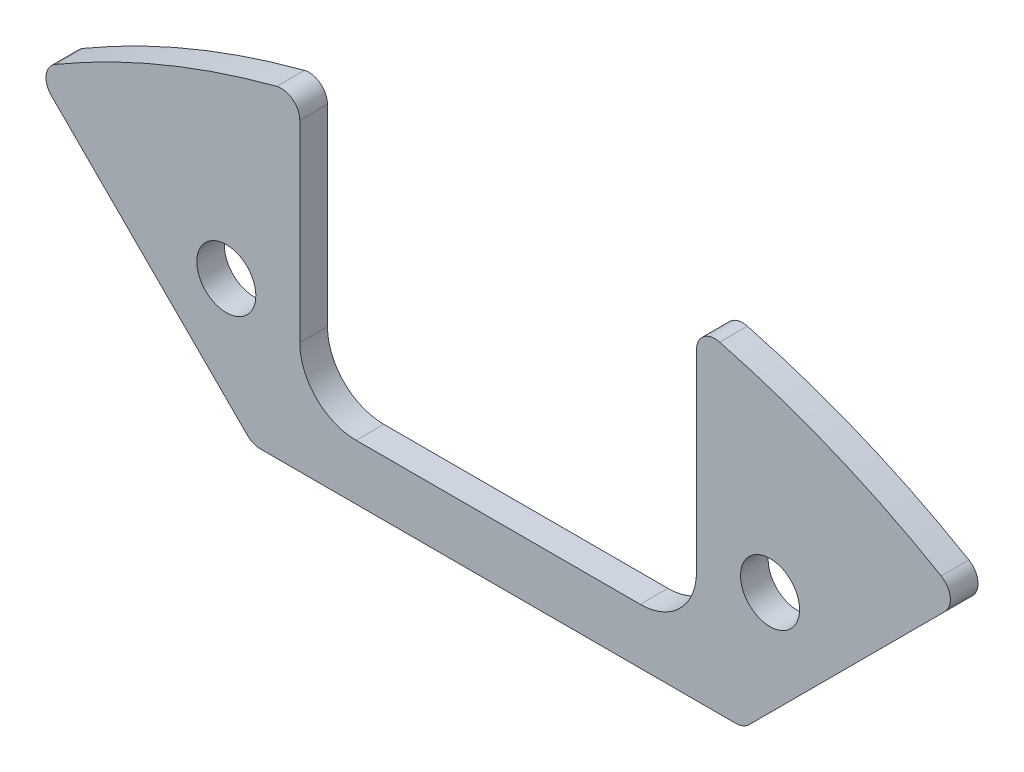
ISO-10303-21;
HEADER;
FILE_DESCRIPTION(('STEP AP214'),'2;1');
FILE_NAME('part.step','',(''),(''),'','','');
FILE_SCHEMA(('AUTOMOTIVE_DESIGN { 1 0 10303 214 1 1 1 1 }'));
ENDSEC;
DATA;
#1=APPLICATION_CONTEXT('core data for automotive mechanical design processes');
#2=APPLICATION_PROTOCOL_DEFINITION('international standard','automotive_design',2000,#1);
#3=PRODUCT_CONTEXT('',#1,'mechanical');
#4=PRODUCT('Part','Part','',(#3));
#5=PRODUCT_RELATED_PRODUCT_CATEGORY('part','',(#4));
#6=PRODUCT_DEFINITION_FORMATION('','',#4);
#7=PRODUCT_DEFINITION_CONTEXT('part definition',#1,'design');
#8=PRODUCT_DEFINITION('design','',#6,#7);
#9=PRODUCT_DEFINITION_SHAPE('','',#8);
#10=(LENGTH_UNIT() NAMED_UNIT(*) SI_UNIT(.MILLI.,.METRE.));
#11=(NAMED_UNIT(*) PLANE_ANGLE_UNIT() SI_UNIT($,.RADIAN.));
#12=(NAMED_UNIT(*) SI_UNIT($,.STERADIAN.) SOLID_ANGLE_UNIT());
#13=UNCERTAINTY_MEASURE_WITH_UNIT(LENGTH_MEASURE(1.E-05),#10,'distance_accuracy_value','');
#14=(GEOMETRIC_REPRESENTATION_CONTEXT(3) GLOBAL_UNCERTAINTY_ASSIGNED_CONTEXT((#13)) GLOBAL_UNIT_ASSIGNED_CONTEXT((#10,
#11,#12)) REPRESENTATION_CONTEXT('',''));
#15=CARTESIAN_POINT('',(0.,0.,0.));
#16=DIRECTION('',(0.,0.,1.));
#17=DIRECTION('',(1.,0.,0.));
#18=AXIS2_PLACEMENT_3D('',#15,#16,#17);
#19=CARTESIAN_POINT('',(0.,0.,1.5));
#20=DIRECTION('',(0.,0.,-1.));
#21=DIRECTION('',(-1.,0.,0.));
#22=AXIS2_PLACEMENT_3D('',#19,#20,#21);
#23=CYLINDRICAL_SURFACE('',#22,47.5);
#24=CARTESIAN_POINT('',(0.,0.,0.));
#25=DIRECTION('',(0.,0.,1.));
#26=DIRECTION('',(1.,0.,0.));
#27=AXIS2_PLACEMENT_3D('',#24,#25,#26);
#28=CIRCLE('',#27,47.5);
#29=CARTESIAN_POINT('',(-12.002688172043,45.9585190867232,0.));
#30=VERTEX_POINT('',#29);
#31=CARTESIAN_POINT('',(-24.0103983005942,40.9847626984325,0.));
#32=VERTEX_POINT('',#31);
#33=EDGE_CURVE('E171',#30,#32,#28,.T.);
#34=ORIENTED_EDGE('',*,*,#33,.T.);
#35=DIRECTION('',(0.,0.,-1.));
#36=VECTOR('',#35,1.);
#37=CARTESIAN_POINT('',(-24.0103983005942,40.9847626984325,1.5));
#38=LINE('',#37,#36);
#39=CARTESIAN_POINT('',(-24.0103983005942,40.9847626984325,1.5));
#40=VERTEX_POINT('',#39);
#41=EDGE_CURVE('E213',#32,#40,#38,.F.);
#42=ORIENTED_EDGE('',*,*,#41,.T.);
#43=CARTESIAN_POINT('',(0.,0.,1.5));
#44=DIRECTION('',(0.,0.,1.));
#45=DIRECTION('',(1.,0.,0.));
#46=AXIS2_PLACEMENT_3D('',#43,#44,#45);
#47=CIRCLE('',#46,47.5);
#48=CARTESIAN_POINT('',(-12.002688172043,45.9585190867232,1.5));
#49=VERTEX_POINT('',#48);
#50=EDGE_CURVE('E174',#49,#40,#47,.T.);
#51=ORIENTED_EDGE('',*,*,#50,.F.);
#52=DIRECTION('',(0.,0.,-1.));
#53=VECTOR('',#52,1.);
#54=CARTESIAN_POINT('',(-12.002688172043,45.9585190867232,1.5));
#55=LINE('',#54,#53);
#56=EDGE_CURVE('E159',#49,#30,#55,.T.);
#57=ORIENTED_EDGE('',*,*,#56,.T.);
#58=EDGE_LOOP('',(#34,#42,#51,#57));
#59=FACE_BOUND('',#58,.T.);
#60=ADVANCED_FACE('F39',(#59),#23,.T.);
#61=CARTESIAN_POINT('',(24.0103983005937,40.9847626984328,1.5));
#62=VERTEX_POINT('',#61);
#63=CARTESIAN_POINT('',(12.002688172043,45.9585190867232,1.5));
#64=VERTEX_POINT('',#63);
#65=EDGE_CURVE('E181',#62,#64,#47,.T.);
#66=ORIENTED_EDGE('',*,*,#65,.F.);
#67=DIRECTION('',(0.,0.,-1.));
#68=VECTOR('',#67,1.);
#69=CARTESIAN_POINT('',(24.0103983005937,40.9847626984328,1.5));
#70=LINE('',#69,#68);
#71=CARTESIAN_POINT('',(24.0103983005937,40.9847626984328,0.));
#72=VERTEX_POINT('',#71);
#73=EDGE_CURVE('E304',#62,#72,#70,.T.);
#74=ORIENTED_EDGE('',*,*,#73,.T.);
#75=CARTESIAN_POINT('',(12.002688172043,45.9585190867232,0.));
#76=VERTEX_POINT('',#75);
#77=EDGE_CURVE('E182',#72,#76,#28,.T.);
#78=ORIENTED_EDGE('',*,*,#77,.T.);
#79=DIRECTION('',(0.,0.,-1.));
#80=VECTOR('',#79,1.);
#81=CARTESIAN_POINT('',(12.002688172043,45.9585190867232,1.5));
#82=LINE('',#81,#80);
#83=EDGE_CURVE('E175',#76,#64,#82,.F.);
#84=ORIENTED_EDGE('',*,*,#83,.T.);
#85=EDGE_LOOP('',(#66,#74,#78,#84));
#86=FACE_BOUND('',#85,.T.);
#87=ADVANCED_FACE('F358',(#86),#23,.T.);
#88=CARTESIAN_POINT('',(0.,0.,1.5));
#89=DIRECTION('',(0.,0.,1.));
#90=DIRECTION('',(1.,0.,0.));
#91=AXIS2_PLACEMENT_3D('',#88,#89,#90);
#92=PLANE('',#91);
#93=DIRECTION('',(1.,0.,0.));
#94=VECTOR('',#93,1.);
#95=CARTESIAN_POINT('',(0.,28.5,1.5));
#96=LINE('',#95,#94);
#97=CARTESIAN_POINT('',(-12.8829906421162,28.5,1.5));
#98=VERTEX_POINT('',#97);
#99=CARTESIAN_POINT('',(12.8829906421156,28.5,1.5));
#100=VERTEX_POINT('',#99);
#101=EDGE_CURVE('E287',#98,#100,#96,.T.);
#102=ORIENTED_EDGE('',*,*,#101,.T.);
#103=CARTESIAN_POINT('',(12.8829906421156,29.5,1.5));
#104=DIRECTION('',(0.,0.,1.));
#105=DIRECTION('',(1.,0.,0.));
#106=AXIS2_PLACEMENT_3D('',#103,#104,#105);
#107=CIRCLE('',#106,1.);
#108=CARTESIAN_POINT('',(13.5900974233022,28.7928932188135,1.5));
#109=VERTEX_POINT('',#108);
#110=EDGE_CURVE('E280',#100,#109,#107,.T.);
#111=ORIENTED_EDGE('',*,*,#110,.T.);
#112=DIRECTION('',(-0.707106781186539,-0.707106781186556,0.));
#113=VECTOR('',#112,1.);
#114=CARTESIAN_POINT('',(14.6724657096205,29.8752615051318,1.5));
#115=LINE('',#114,#113);
#116=CARTESIAN_POINT('',(24.212023012294,39.4148188078056,1.5));
#117=VERTEX_POINT('',#116);
#118=EDGE_CURVE('E264',#117,#109,#115,.T.);
#119=ORIENTED_EDGE('',*,*,#118,.F.);
#120=CARTESIAN_POINT('',(23.5049162311075,40.1219255889921,1.5));
#121=DIRECTION('',(0.,0.,1.));
#122=DIRECTION('',(1.,0.,0.));
#123=AXIS2_PLACEMENT_3D('',#120,#121,#122);
#124=CIRCLE('',#123,1.);
#125=EDGE_CURVE('E218',#117,#62,#124,.T.);
#126=ORIENTED_EDGE('',*,*,#125,.T.);
#127=ORIENTED_EDGE('',*,*,#65,.T.);
#128=CARTESIAN_POINT('',(11.75,44.9909713164764,1.5));
#129=DIRECTION('',(0.,0.,1.));
#130=DIRECTION('',(1.,0.,0.));
#131=AXIS2_PLACEMENT_3D('',#128,#129,#130);
#132=CIRCLE('',#131,1.);
#133=CARTESIAN_POINT('',(10.75,44.9909713164764,1.5));
#134=VERTEX_POINT('',#133);
#135=EDGE_CURVE('E194',#64,#134,#132,.T.);
#136=ORIENTED_EDGE('',*,*,#135,.T.);
#137=DIRECTION('',(0.,1.,0.));
#138=VECTOR('',#137,1.);
#139=CARTESIAN_POINT('',(10.75,43.525,1.5));
#140=LINE('',#139,#138);
#141=CARTESIAN_POINT('',(10.75,34.55,1.5));
#142=VERTEX_POINT('',#141);
#143=EDGE_CURVE('E231',#142,#134,#140,.T.);
#144=ORIENTED_EDGE('',*,*,#143,.F.);
#145=CARTESIAN_POINT('',(7.70000000000001,34.55,1.5));
#146=DIRECTION('',(0.,0.,1.));
#147=DIRECTION('',(1.,0.,0.));
#148=AXIS2_PLACEMENT_3D('',#145,#146,#147);
#149=CIRCLE('',#148,3.05);
#150=CARTESIAN_POINT('',(7.70000000000001,31.5,1.5));
#151=VERTEX_POINT('',#150);
#152=EDGE_CURVE('E337',#142,#151,#149,.F.);
#153=ORIENTED_EDGE('',*,*,#152,.T.);
#154=DIRECTION('',(1.,0.,0.));
#155=VECTOR('',#154,1.);
#156=CARTESIAN_POINT('',(-10.75,31.5,1.5));
#157=LINE('',#156,#155);
#158=CARTESIAN_POINT('',(-7.69999999999999,31.5,1.5));
#159=VERTEX_POINT('',#158);
#160=EDGE_CURVE('E240',#159,#151,#157,.T.);
#161=ORIENTED_EDGE('',*,*,#160,.F.);
#162=CARTESIAN_POINT('',(-7.69999999999999,34.55,1.5));
#163=DIRECTION('',(0.,0.,1.));
#164=DIRECTION('',(1.,0.,0.));
#165=AXIS2_PLACEMENT_3D('',#162,#163,#164);
#166=CIRCLE('',#165,3.05);
#167=CARTESIAN_POINT('',(-10.75,34.55,1.5));
#168=VERTEX_POINT('',#167);
#169=EDGE_CURVE('E329',#159,#168,#166,.F.);
#170=ORIENTED_EDGE('',*,*,#169,.T.);
#171=DIRECTION('',(0.,-1.,0.));
#172=VECTOR('',#171,1.);
#173=CARTESIAN_POINT('',(-10.75,31.5,1.5));
#174=LINE('',#173,#172);
#175=CARTESIAN_POINT('',(-10.75,44.9909713164764,1.5));
#176=VERTEX_POINT('',#175);
#177=EDGE_CURVE('E235',#176,#168,#174,.T.);
#178=ORIENTED_EDGE('',*,*,#177,.F.);
#179=CARTESIAN_POINT('',(-11.75,44.9909713164764,1.5));
#180=DIRECTION('',(0.,0.,1.));
#181=DIRECTION('',(1.,0.,0.));
#182=AXIS2_PLACEMENT_3D('',#179,#180,#181);
#183=CIRCLE('',#182,1.);
#184=EDGE_CURVE('E191',#176,#49,#183,.T.);
#185=ORIENTED_EDGE('',*,*,#184,.T.);
#186=ORIENTED_EDGE('',*,*,#50,.T.);
#187=CARTESIAN_POINT('',(-23.504916231108,40.1219255889918,1.5));
#188=DIRECTION('',(0.,0.,1.));
#189=DIRECTION('',(1.,0.,0.));
#190=AXIS2_PLACEMENT_3D('',#187,#188,#189);
#191=CIRCLE('',#190,1.);
#192=CARTESIAN_POINT('',(-24.2120230122946,39.4148188078052,1.5));
#193=VERTEX_POINT('',#192);
#194=EDGE_CURVE('E207',#40,#193,#191,.T.);
#195=ORIENTED_EDGE('',*,*,#194,.T.);
#196=DIRECTION('',(-0.707106781186549,0.707106781186546,0.));
#197=VECTOR('',#196,1.);
#198=CARTESIAN_POINT('',(-23.1754247533892,38.3782205488998,1.5));
#199=LINE('',#198,#197);
#200=CARTESIAN_POINT('',(-13.5900974233028,28.7928932188135,1.5));
#201=VERTEX_POINT('',#200);
#202=EDGE_CURVE('E260',#201,#193,#199,.T.);
#203=ORIENTED_EDGE('',*,*,#202,.F.);
#204=CARTESIAN_POINT('',(-12.8829906421162,29.5,1.5));
#205=DIRECTION('',(0.,0.,1.));
#206=DIRECTION('',(1.,0.,0.));
#207=AXIS2_PLACEMENT_3D('',#204,#205,#206);
#208=CIRCLE('',#207,1.);
#209=EDGE_CURVE('E276',#201,#98,#208,.T.);
#210=ORIENTED_EDGE('',*,*,#209,.T.);
#211=EDGE_LOOP('',(#102,#111,#119,#126,#127,#136,#144,#153,#161,#170,#178,#185,#186,#195,#203,#210));
#212=FACE_BOUND('',#211,.T.);
#213=CARTESIAN_POINT('',(-14.7333121460563,35.5693620016844,1.5));
#214=DIRECTION('',(0.,0.,1.));
#215=DIRECTION('',(0.707106781186546,0.707106781186549,0.));
#216=AXIS2_PLACEMENT_3D('',#213,#214,#215);
#217=CIRCLE('',#216,1.6);
#218=CARTESIAN_POINT('',(-13.6019412961578,36.7007328515829,1.5));
#219=VERTEX_POINT('',#218);
#220=EDGE_CURVE('E269',#219,#219,#217,.T.);
#221=ORIENTED_EDGE('',*,*,#220,.F.);
#222=EDGE_LOOP('',(#221));
#223=FACE_BOUND('',#222,.T.);
#224=CARTESIAN_POINT('',(14.7333121460557,35.5693620016846,1.5));
#225=DIRECTION('',(0.,0.,1.));
#226=DIRECTION('',(1.,0.,0.));
#227=AXIS2_PLACEMENT_3D('',#224,#225,#226);
#228=CIRCLE('',#227,1.6);
#229=CARTESIAN_POINT('',(16.3333121460557,35.5693620016846,1.5));
#230=VERTEX_POINT('',#229);
#231=EDGE_CURVE('E254',#230,#230,#228,.T.);
#232=ORIENTED_EDGE('',*,*,#231,.F.);
#233=EDGE_LOOP('',(#232));
#234=FACE_BOUND('',#233,.T.);
#235=ADVANCED_FACE('F318',(#212,#223,#234),#92,.T.);
#236=CARTESIAN_POINT('',(0.,0.,0.));
#237=DIRECTION('',(0.,0.,1.));
#238=DIRECTION('',(1.,0.,0.));
#239=AXIS2_PLACEMENT_3D('',#236,#237,#238);
#240=PLANE('',#239);
#241=DIRECTION('',(-0.707106781186539,-0.707106781186556,0.));
#242=VECTOR('',#241,1.);
#243=CARTESIAN_POINT('',(14.6724657096205,29.8752615051318,0.));
#244=LINE('',#243,#242);
#245=CARTESIAN_POINT('',(24.212023012294,39.4148188078056,0.));
#246=VERTEX_POINT('',#245);
#247=CARTESIAN_POINT('',(13.5900974233022,28.7928932188135,0.));
#248=VERTEX_POINT('',#247);
#249=EDGE_CURVE('E263',#246,#248,#244,.T.);
#250=ORIENTED_EDGE('',*,*,#249,.T.);
#251=CARTESIAN_POINT('',(12.8829906421156,29.5,0.));
#252=DIRECTION('',(0.,0.,1.));
#253=DIRECTION('',(1.,0.,0.));
#254=AXIS2_PLACEMENT_3D('',#251,#252,#253);
#255=CIRCLE('',#254,1.);
#256=CARTESIAN_POINT('',(12.8829906421156,28.5,0.));
#257=VERTEX_POINT('',#256);
#258=EDGE_CURVE('E47',#248,#257,#255,.F.);
#259=ORIENTED_EDGE('',*,*,#258,.T.);
#260=DIRECTION('',(1.,0.,0.));
#261=VECTOR('',#260,1.);
#262=CARTESIAN_POINT('',(0.,28.5,0.));
#263=LINE('',#262,#261);
#264=CARTESIAN_POINT('',(-12.8829906421162,28.5,0.));
#265=VERTEX_POINT('',#264);
#266=EDGE_CURVE('E273',#265,#257,#263,.T.);
#267=ORIENTED_EDGE('',*,*,#266,.F.);
#268=CARTESIAN_POINT('',(-12.8829906421162,29.5,0.));
#269=DIRECTION('',(0.,0.,1.));
#270=DIRECTION('',(1.,0.,0.));
#271=AXIS2_PLACEMENT_3D('',#268,#269,#270);
#272=CIRCLE('',#271,1.);
#273=CARTESIAN_POINT('',(-13.5900974233028,28.7928932188135,0.));
#274=VERTEX_POINT('',#273);
#275=EDGE_CURVE('E54',#265,#274,#272,.F.);
#276=ORIENTED_EDGE('',*,*,#275,.T.);
#277=DIRECTION('',(-0.707106781186549,0.707106781186546,0.));
#278=VECTOR('',#277,1.);
#279=CARTESIAN_POINT('',(-23.1754247533892,38.3782205488998,0.));
#280=LINE('',#279,#278);
#281=CARTESIAN_POINT('',(-24.2120230122946,39.4148188078052,0.));
#282=VERTEX_POINT('',#281);
#283=EDGE_CURVE('E258',#274,#282,#280,.T.);
#284=ORIENTED_EDGE('',*,*,#283,.T.);
#285=CARTESIAN_POINT('',(-23.504916231108,40.1219255889918,0.));
#286=DIRECTION('',(0.,0.,1.));
#287=DIRECTION('',(1.,0.,0.));
#288=AXIS2_PLACEMENT_3D('',#285,#286,#287);
#289=CIRCLE('',#288,1.);
#290=EDGE_CURVE('E180',#282,#32,#289,.F.);
#291=ORIENTED_EDGE('',*,*,#290,.T.);
#292=ORIENTED_EDGE('',*,*,#33,.F.);
#293=CARTESIAN_POINT('',(-11.75,44.9909713164764,0.));
#294=DIRECTION('',(0.,0.,1.));
#295=DIRECTION('',(1.,0.,0.));
#296=AXIS2_PLACEMENT_3D('',#293,#294,#295);
#297=CIRCLE('',#296,1.);
#298=CARTESIAN_POINT('',(-10.75,44.9909713164764,0.));
#299=VERTEX_POINT('',#298);
#300=EDGE_CURVE('E155',#30,#299,#297,.F.);
#301=ORIENTED_EDGE('',*,*,#300,.T.);
#302=DIRECTION('',(0.,-1.,0.));
#303=VECTOR('',#302,1.);
#304=CARTESIAN_POINT('',(-10.75,31.5,0.));
#305=LINE('',#304,#303);
#306=CARTESIAN_POINT('',(-10.75,34.55,0.));
#307=VERTEX_POINT('',#306);
#308=EDGE_CURVE('E249',#299,#307,#305,.T.);
#309=ORIENTED_EDGE('',*,*,#308,.T.);
#310=CARTESIAN_POINT('',(-7.69999999999999,34.55,0.));
#311=DIRECTION('',(0.,0.,1.));
#312=DIRECTION('',(1.,0.,0.));
#313=AXIS2_PLACEMENT_3D('',#310,#311,#312);
#314=CIRCLE('',#313,3.05);
#315=CARTESIAN_POINT('',(-7.69999999999999,31.5,0.));
#316=VERTEX_POINT('',#315);
#317=EDGE_CURVE('E328',#307,#316,#314,.T.);
#318=ORIENTED_EDGE('',*,*,#317,.T.);
#319=DIRECTION('',(1.,0.,0.));
#320=VECTOR('',#319,1.);
#321=CARTESIAN_POINT('',(-10.75,31.5,0.));
#322=LINE('',#321,#320);
#323=CARTESIAN_POINT('',(7.70000000000001,31.5,0.));
#324=VERTEX_POINT('',#323);
#325=EDGE_CURVE('E185',#316,#324,#322,.T.);
#326=ORIENTED_EDGE('',*,*,#325,.T.);
#327=CARTESIAN_POINT('',(7.70000000000001,34.55,0.));
#328=DIRECTION('',(0.,0.,1.));
#329=DIRECTION('',(1.,0.,0.));
#330=AXIS2_PLACEMENT_3D('',#327,#328,#329);
#331=CIRCLE('',#330,3.05);
#332=CARTESIAN_POINT('',(10.75,34.55,0.));
#333=VERTEX_POINT('',#332);
#334=EDGE_CURVE('E333',#324,#333,#331,.T.);
#335=ORIENTED_EDGE('',*,*,#334,.T.);
#336=DIRECTION('',(0.,1.,0.));
#337=VECTOR('',#336,1.);
#338=CARTESIAN_POINT('',(10.75,43.525,0.));
#339=LINE('',#338,#337);
#340=CARTESIAN_POINT('',(10.75,44.9909713164764,0.));
#341=VERTEX_POINT('',#340);
#342=EDGE_CURVE('E243',#333,#341,#339,.T.);
#343=ORIENTED_EDGE('',*,*,#342,.T.);
#344=CARTESIAN_POINT('',(11.75,44.9909713164764,0.));
#345=DIRECTION('',(0.,0.,1.));
#346=DIRECTION('',(1.,0.,0.));
#347=AXIS2_PLACEMENT_3D('',#344,#345,#346);
#348=CIRCLE('',#347,1.);
#349=EDGE_CURVE('E164',#341,#76,#348,.F.);
#350=ORIENTED_EDGE('',*,*,#349,.T.);
#351=ORIENTED_EDGE('',*,*,#77,.F.);
#352=CARTESIAN_POINT('',(23.5049162311075,40.1219255889921,0.));
#353=DIRECTION('',(0.,0.,1.));
#354=DIRECTION('',(1.,0.,0.));
#355=AXIS2_PLACEMENT_3D('',#352,#353,#354);
#356=CIRCLE('',#355,1.);
#357=EDGE_CURVE('E221',#72,#246,#356,.F.);
#358=ORIENTED_EDGE('',*,*,#357,.T.);
#359=EDGE_LOOP('',(#250,#259,#267,#276,#284,#291,#292,#301,#309,#318,#326,#335,#343,#350,#351,#358));
#360=FACE_BOUND('',#359,.T.);
#361=CARTESIAN_POINT('',(-14.7333121460563,35.5693620016844,0.));
#362=DIRECTION('',(0.,0.,1.));
#363=DIRECTION('',(0.707106781186546,0.707106781186549,0.));
#364=AXIS2_PLACEMENT_3D('',#361,#362,#363);
#365=CIRCLE('',#364,1.6);
#366=CARTESIAN_POINT('',(-13.6019412961578,36.7007328515829,0.));
#367=VERTEX_POINT('',#366);
#368=EDGE_CURVE('E267',#367,#367,#365,.T.);
#369=ORIENTED_EDGE('',*,*,#368,.T.);
#370=EDGE_LOOP('',(#369));
#371=FACE_BOUND('',#370,.T.);
#372=CARTESIAN_POINT('',(14.7333121460557,35.5693620016846,0.));
#373=DIRECTION('',(0.,0.,1.));
#374=DIRECTION('',(1.,0.,0.));
#375=AXIS2_PLACEMENT_3D('',#372,#373,#374);
#376=CIRCLE('',#375,1.6);
#377=CARTESIAN_POINT('',(16.3333121460557,35.5693620016846,0.));
#378=VERTEX_POINT('',#377);
#379=EDGE_CURVE('E236',#378,#378,#376,.T.);
#380=ORIENTED_EDGE('',*,*,#379,.T.);
#381=EDGE_LOOP('',(#380));
#382=FACE_BOUND('',#381,.T.);
#383=ADVANCED_FACE('F177',(#360,#371,#382),#240,.F.);
#384=CARTESIAN_POINT('',(10.75,43.525,0.));
#385=DIRECTION('',(1.,0.,0.));
#386=DIRECTION('',(0.,1.,0.));
#387=AXIS2_PLACEMENT_3D('',#384,#385,#386);
#388=PLANE('',#387);
#389=ORIENTED_EDGE('',*,*,#143,.T.);
#390=DIRECTION('',(0.,0.,-1.));
#391=VECTOR('',#390,1.);
#392=CARTESIAN_POINT('',(10.75,44.9909713164764,0.));
#393=LINE('',#392,#391);
#394=EDGE_CURVE('E165',#134,#341,#393,.T.);
#395=ORIENTED_EDGE('',*,*,#394,.T.);
#396=ORIENTED_EDGE('',*,*,#342,.F.);
#397=DIRECTION('',(0.,0.,1.));
#398=VECTOR('',#397,1.);
#399=CARTESIAN_POINT('',(10.75,34.55,1.5));
#400=LINE('',#399,#398);
#401=EDGE_CURVE('E345',#333,#142,#400,.T.);
#402=ORIENTED_EDGE('',*,*,#401,.T.);
#403=EDGE_LOOP('',(#389,#395,#396,#402));
#404=FACE_BOUND('',#403,.T.);
#405=ADVANCED_FACE('F355',(#404),#388,.F.);
#406=CARTESIAN_POINT('',(-10.75,43.525,0.));
#407=DIRECTION('',(-1.,0.,0.));
#408=DIRECTION('',(0.,-1.,0.));
#409=AXIS2_PLACEMENT_3D('',#406,#407,#408);
#410=PLANE('',#409);
#411=ORIENTED_EDGE('',*,*,#308,.F.);
#412=DIRECTION('',(0.,0.,-1.));
#413=VECTOR('',#412,1.);
#414=CARTESIAN_POINT('',(-10.75,44.9909713164764,0.));
#415=LINE('',#414,#413);
#416=EDGE_CURVE('E161',#299,#176,#415,.F.);
#417=ORIENTED_EDGE('',*,*,#416,.T.);
#418=ORIENTED_EDGE('',*,*,#177,.T.);
#419=DIRECTION('',(0.,0.,1.));
#420=VECTOR('',#419,1.);
#421=CARTESIAN_POINT('',(-10.75,34.55,0.));
#422=LINE('',#421,#420);
#423=EDGE_CURVE('E339',#168,#307,#422,.F.);
#424=ORIENTED_EDGE('',*,*,#423,.T.);
#425=EDGE_LOOP('',(#411,#417,#418,#424));
#426=FACE_BOUND('',#425,.T.);
#427=ADVANCED_FACE('F407',(#426),#410,.F.);
#428=CARTESIAN_POINT('',(-10.75,31.5,0.));
#429=DIRECTION('',(0.,-1.,0.));
#430=DIRECTION('',(0.,0.,-1.));
#431=AXIS2_PLACEMENT_3D('',#428,#429,#430);
#432=PLANE('',#431);
#433=ORIENTED_EDGE('',*,*,#160,.T.);
#434=DIRECTION('',(0.,0.,1.));
#435=VECTOR('',#434,1.);
#436=CARTESIAN_POINT('',(7.70000000000001,31.5,0.));
#437=LINE('',#436,#435);
#438=EDGE_CURVE('E341',#151,#324,#437,.F.);
#439=ORIENTED_EDGE('',*,*,#438,.T.);
#440=ORIENTED_EDGE('',*,*,#325,.F.);
#441=DIRECTION('',(0.,0.,1.));
#442=VECTOR('',#441,1.);
#443=CARTESIAN_POINT('',(-7.69999999999999,31.5,1.5));
#444=LINE('',#443,#442);
#445=EDGE_CURVE('E343',#316,#159,#444,.T.);
#446=ORIENTED_EDGE('',*,*,#445,.T.);
#447=EDGE_LOOP('',(#433,#439,#440,#446));
#448=FACE_BOUND('',#447,.T.);
#449=ADVANCED_FACE('F403',(#448),#432,.F.);
#450=CARTESIAN_POINT('',(14.7333121460557,35.5693620016846,0.));
#451=DIRECTION('',(0.,0.,1.));
#452=DIRECTION('',(1.,0.,0.));
#453=AXIS2_PLACEMENT_3D('',#450,#451,#452);
#454=CYLINDRICAL_SURFACE('',#453,1.6);
#455=ORIENTED_EDGE('',*,*,#379,.F.);
#456=EDGE_LOOP('',(#455));
#457=FACE_BOUND('',#456,.T.);
#458=ORIENTED_EDGE('',*,*,#231,.T.);
#459=EDGE_LOOP('',(#458));
#460=FACE_BOUND('',#459,.T.);
#461=ADVANCED_FACE('F370',(#457,#460),#454,.F.);
#462=CARTESIAN_POINT('',(11.75,44.9909713164764,1.5));
#463=DIRECTION('',(0.,0.,-1.));
#464=DIRECTION('',(-1.,0.,0.));
#465=AXIS2_PLACEMENT_3D('',#462,#463,#464);
#466=CYLINDRICAL_SURFACE('',#465,1.);
#467=ORIENTED_EDGE('',*,*,#349,.F.);
#468=ORIENTED_EDGE('',*,*,#394,.F.);
#469=ORIENTED_EDGE('',*,*,#135,.F.);
#470=ORIENTED_EDGE('',*,*,#83,.F.);
#471=EDGE_LOOP('',(#467,#468,#469,#470));
#472=FACE_BOUND('',#471,.T.);
#473=ADVANCED_FACE('F357',(#472),#466,.T.);
#474=CARTESIAN_POINT('',(-11.75,44.9909713164764,1.5));
#475=DIRECTION('',(0.,0.,-1.));
#476=DIRECTION('',(-1.,0.,0.));
#477=AXIS2_PLACEMENT_3D('',#474,#475,#476);
#478=CYLINDRICAL_SURFACE('',#477,1.);
#479=ORIENTED_EDGE('',*,*,#184,.F.);
#480=ORIENTED_EDGE('',*,*,#416,.F.);
#481=ORIENTED_EDGE('',*,*,#300,.F.);
#482=ORIENTED_EDGE('',*,*,#56,.F.);
#483=EDGE_LOOP('',(#479,#480,#481,#482));
#484=FACE_BOUND('',#483,.T.);
#485=ADVANCED_FACE('F158',(#484),#478,.T.);
#486=CARTESIAN_POINT('',(7.70000000000001,34.55,0.));
#487=DIRECTION('',(0.,0.,-1.));
#488=DIRECTION('',(-1.,0.,0.));
#489=AXIS2_PLACEMENT_3D('',#486,#487,#488);
#490=CYLINDRICAL_SURFACE('',#489,3.05);
#491=ORIENTED_EDGE('',*,*,#334,.F.);
#492=ORIENTED_EDGE('',*,*,#438,.F.);
#493=ORIENTED_EDGE('',*,*,#152,.F.);
#494=ORIENTED_EDGE('',*,*,#401,.F.);
#495=EDGE_LOOP('',(#491,#492,#493,#494));
#496=FACE_BOUND('',#495,.T.);
#497=ADVANCED_FACE('F373',(#496),#490,.F.);
#498=CARTESIAN_POINT('',(-7.69999999999999,34.55,0.));
#499=DIRECTION('',(0.,0.,-1.));
#500=DIRECTION('',(-1.,0.,0.));
#501=AXIS2_PLACEMENT_3D('',#498,#499,#500);
#502=CYLINDRICAL_SURFACE('',#501,3.05);
#503=ORIENTED_EDGE('',*,*,#317,.F.);
#504=ORIENTED_EDGE('',*,*,#423,.F.);
#505=ORIENTED_EDGE('',*,*,#169,.F.);
#506=ORIENTED_EDGE('',*,*,#445,.F.);
#507=EDGE_LOOP('',(#503,#504,#505,#506));
#508=FACE_BOUND('',#507,.T.);
#509=ADVANCED_FACE('F376',(#508),#502,.F.);
#510=CARTESIAN_POINT('',(-23.1754247533892,38.3782205488998,0.));
#511=DIRECTION('',(0.707106781186546,0.707106781186548,0.));
#512=DIRECTION('',(-0.707106781186549,0.707106781186546,0.));
#513=AXIS2_PLACEMENT_3D('',#510,#511,#512);
#514=PLANE('',#513);
#515=ORIENTED_EDGE('',*,*,#283,.F.);
#516=DIRECTION('',(0.,0.,1.));
#517=VECTOR('',#516,1.);
#518=CARTESIAN_POINT('',(-13.5900974233028,28.7928932188135,1.5));
#519=LINE('',#518,#517);
#520=EDGE_CURVE('E12',#274,#201,#519,.T.);
#521=ORIENTED_EDGE('',*,*,#520,.T.);
#522=ORIENTED_EDGE('',*,*,#202,.T.);
#523=DIRECTION('',(0.,0.,-1.));
#524=VECTOR('',#523,1.);
#525=CARTESIAN_POINT('',(-24.2120230122946,39.4148188078052,0.));
#526=LINE('',#525,#524);
#527=EDGE_CURVE('E212',#193,#282,#526,.T.);
#528=ORIENTED_EDGE('',*,*,#527,.T.);
#529=EDGE_LOOP('',(#515,#521,#522,#528));
#530=FACE_BOUND('',#529,.T.);
#531=ADVANCED_FACE('F324',(#530),#514,.F.);
#532=CARTESIAN_POINT('',(23.1754247533886,38.3782205489001,0.));
#533=DIRECTION('',(-0.707106781186556,0.707106781186539,0.));
#534=DIRECTION('',(-0.707106781186539,-0.707106781186556,0.));
#535=AXIS2_PLACEMENT_3D('',#532,#533,#534);
#536=PLANE('',#535);
#537=ORIENTED_EDGE('',*,*,#118,.T.);
#538=DIRECTION('',(0.,0.,1.));
#539=VECTOR('',#538,1.);
#540=CARTESIAN_POINT('',(13.5900974233022,28.7928932188135,0.));
#541=LINE('',#540,#539);
#542=EDGE_CURVE('E62',#109,#248,#541,.F.);
#543=ORIENTED_EDGE('',*,*,#542,.T.);
#544=ORIENTED_EDGE('',*,*,#249,.F.);
#545=DIRECTION('',(0.,0.,-1.));
#546=VECTOR('',#545,1.);
#547=CARTESIAN_POINT('',(24.212023012294,39.4148188078056,0.));
#548=LINE('',#547,#546);
#549=EDGE_CURVE('E302',#246,#117,#548,.F.);
#550=ORIENTED_EDGE('',*,*,#549,.T.);
#551=EDGE_LOOP('',(#537,#543,#544,#550));
#552=FACE_BOUND('',#551,.T.);
#553=ADVANCED_FACE('F316',(#552),#536,.F.);
#554=CARTESIAN_POINT('',(-14.7333121460563,35.5693620016844,0.));
#555=DIRECTION('',(0.,0.,1.));
#556=DIRECTION('',(1.,0.,0.));
#557=AXIS2_PLACEMENT_3D('',#554,#555,#556);
#558=CYLINDRICAL_SURFACE('',#557,1.6);
#559=ORIENTED_EDGE('',*,*,#368,.F.);
#560=EDGE_LOOP('',(#559));
#561=FACE_BOUND('',#560,.T.);
#562=ORIENTED_EDGE('',*,*,#220,.T.);
#563=EDGE_LOOP('',(#562));
#564=FACE_BOUND('',#563,.T.);
#565=ADVANCED_FACE('F383',(#561,#564),#558,.F.);
#566=CARTESIAN_POINT('',(-23.504916231108,40.1219255889918,1.5));
#567=DIRECTION('',(0.,0.,-1.));
#568=DIRECTION('',(-1.,0.,0.));
#569=AXIS2_PLACEMENT_3D('',#566,#567,#568);
#570=CYLINDRICAL_SURFACE('',#569,1.);
#571=ORIENTED_EDGE('',*,*,#290,.F.);
#572=ORIENTED_EDGE('',*,*,#527,.F.);
#573=ORIENTED_EDGE('',*,*,#194,.F.);
#574=ORIENTED_EDGE('',*,*,#41,.F.);
#575=EDGE_LOOP('',(#571,#572,#573,#574));
#576=FACE_BOUND('',#575,.T.);
#577=ADVANCED_FACE('F327',(#576),#570,.T.);
#578=CARTESIAN_POINT('',(23.5049162311075,40.1219255889921,1.5));
#579=DIRECTION('',(0.,0.,-1.));
#580=DIRECTION('',(-1.,0.,0.));
#581=AXIS2_PLACEMENT_3D('',#578,#579,#580);
#582=CYLINDRICAL_SURFACE('',#581,1.);
#583=ORIENTED_EDGE('',*,*,#125,.F.);
#584=ORIENTED_EDGE('',*,*,#549,.F.);
#585=ORIENTED_EDGE('',*,*,#357,.F.);
#586=ORIENTED_EDGE('',*,*,#73,.F.);
#587=EDGE_LOOP('',(#583,#584,#585,#586));
#588=FACE_BOUND('',#587,.T.);
#589=ADVANCED_FACE('F315',(#588),#582,.T.);
#590=CARTESIAN_POINT('',(0.,28.5,0.));
#591=DIRECTION('',(0.,-1.,0.));
#592=DIRECTION('',(0.,0.,-1.));
#593=AXIS2_PLACEMENT_3D('',#590,#591,#592);
#594=PLANE('',#593);
#595=ORIENTED_EDGE('',*,*,#266,.T.);
#596=DIRECTION('',(0.,0.,1.));
#597=VECTOR('',#596,1.);
#598=CARTESIAN_POINT('',(12.8829906421156,28.5,1.5));
#599=LINE('',#598,#597);
#600=EDGE_CURVE('E281',#257,#100,#599,.T.);
#601=ORIENTED_EDGE('',*,*,#600,.T.);
#602=ORIENTED_EDGE('',*,*,#101,.F.);
#603=DIRECTION('',(0.,0.,1.));
#604=VECTOR('',#603,1.);
#605=CARTESIAN_POINT('',(-12.8829906421162,28.5,0.));
#606=LINE('',#605,#604);
#607=EDGE_CURVE('E298',#98,#265,#606,.F.);
#608=ORIENTED_EDGE('',*,*,#607,.T.);
#609=EDGE_LOOP('',(#595,#601,#602,#608));
#610=FACE_BOUND('',#609,.T.);
#611=ADVANCED_FACE('F295',(#610),#594,.T.);
#612=CARTESIAN_POINT('',(12.8829906421156,29.5,0.));
#613=DIRECTION('',(0.,0.,-1.));
#614=DIRECTION('',(-1.,0.,0.));
#615=AXIS2_PLACEMENT_3D('',#612,#613,#614);
#616=CYLINDRICAL_SURFACE('',#615,1.);
#617=ORIENTED_EDGE('',*,*,#258,.F.);
#618=ORIENTED_EDGE('',*,*,#542,.F.);
#619=ORIENTED_EDGE('',*,*,#110,.F.);
#620=ORIENTED_EDGE('',*,*,#600,.F.);
#621=EDGE_LOOP('',(#617,#618,#619,#620));
#622=FACE_BOUND('',#621,.T.);
#623=ADVANCED_FACE('F301',(#622),#616,.T.);
#624=CARTESIAN_POINT('',(-12.8829906421162,29.5,0.));
#625=DIRECTION('',(0.,0.,-1.));
#626=DIRECTION('',(-1.,0.,0.));
#627=AXIS2_PLACEMENT_3D('',#624,#625,#626);
#628=CYLINDRICAL_SURFACE('',#627,1.);
#629=ORIENTED_EDGE('',*,*,#275,.F.);
#630=ORIENTED_EDGE('',*,*,#607,.F.);
#631=ORIENTED_EDGE('',*,*,#209,.F.);
#632=ORIENTED_EDGE('',*,*,#520,.F.);
#633=EDGE_LOOP('',(#629,#630,#631,#632));
#634=FACE_BOUND('',#633,.T.);
#635=ADVANCED_FACE('F41',(#634),#628,.T.);
#636=CLOSED_SHELL('',(#60,#87,#235,#383,#405,#427,#449,#461,#473,#485,#497,#509,#531,#553,#565,
#577,#589,#611,#623,#635));
#637=MANIFOLD_SOLID_BREP('B2',#636);
#638=ADVANCED_BREP_SHAPE_REPRESENTATION('',(#18,#637),#14);
#639=SHAPE_DEFINITION_REPRESENTATION(#9,#638);
ENDSEC;
END-ISO-10303-21;
